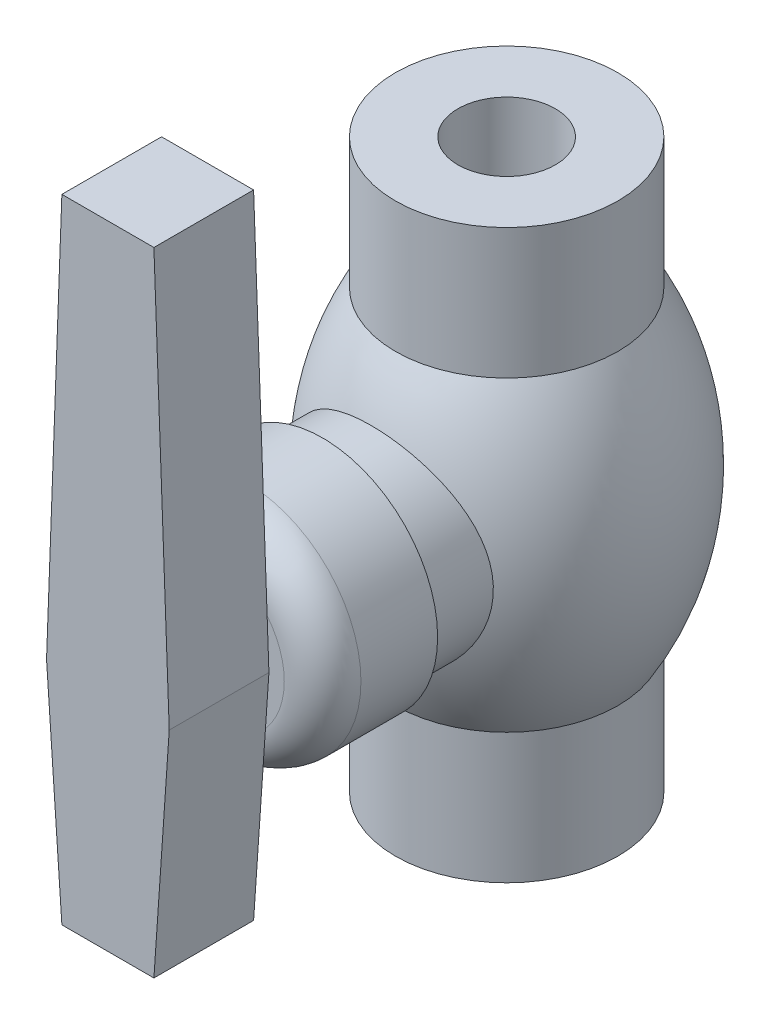
ISO-10303-21;
HEADER;
FILE_DESCRIPTION(('STEP AP214'),'2;1');
FILE_NAME('part.step','',(''),(''),'','','');
FILE_SCHEMA(('AUTOMOTIVE_DESIGN { 1 0 10303 214 1 1 1 1 }'));
ENDSEC;
DATA;
#1=APPLICATION_CONTEXT('core data for automotive mechanical design processes');
#2=APPLICATION_PROTOCOL_DEFINITION('international standard','automotive_design',2000,#1);
#3=PRODUCT_CONTEXT('',#1,'mechanical');
#4=PRODUCT('Part','Part','',(#3));
#5=PRODUCT_RELATED_PRODUCT_CATEGORY('part','',(#4));
#6=PRODUCT_DEFINITION_FORMATION('','',#4);
#7=PRODUCT_DEFINITION_CONTEXT('part definition',#1,'design');
#8=PRODUCT_DEFINITION('design','',#6,#7);
#9=PRODUCT_DEFINITION_SHAPE('','',#8);
#10=(LENGTH_UNIT() NAMED_UNIT(*) SI_UNIT(.MILLI.,.METRE.));
#11=(NAMED_UNIT(*) PLANE_ANGLE_UNIT() SI_UNIT($,.RADIAN.));
#12=(NAMED_UNIT(*) SI_UNIT($,.STERADIAN.) SOLID_ANGLE_UNIT());
#13=UNCERTAINTY_MEASURE_WITH_UNIT(LENGTH_MEASURE(1.E-05),#10,'distance_accuracy_value','');
#14=(GEOMETRIC_REPRESENTATION_CONTEXT(3) GLOBAL_UNCERTAINTY_ASSIGNED_CONTEXT((#13)) GLOBAL_UNIT_ASSIGNED_CONTEXT((#10,
#11,#12)) REPRESENTATION_CONTEXT('',''));
#15=CARTESIAN_POINT('',(0.,0.,0.));
#16=DIRECTION('',(0.,0.,1.));
#17=DIRECTION('',(1.,0.,0.));
#18=AXIS2_PLACEMENT_3D('',#15,#16,#17);
#19=CARTESIAN_POINT('',(0.,37.,39.));
#20=DIRECTION('',(0.,0.,1.));
#21=DIRECTION('',(1.,0.,0.));
#22=AXIS2_PLACEMENT_3D('',#19,#20,#21);
#23=PLANE('',#22);
#24=DIRECTION('',(-0.0373570833848564,0.999301980544909,0.));
#25=VECTOR('',#24,1.);
#26=CARTESIAN_POINT('',(6.,90.5,39.));
#27=LINE('',#26,#25);
#28=CARTESIAN_POINT('',(8.,37.,39.));
#29=VERTEX_POINT('',#28);
#30=CARTESIAN_POINT('',(7.76441521188647,43.301893082037,39.));
#31=VERTEX_POINT('',#30);
#32=EDGE_CURVE('E65',#29,#31,#27,.T.);
#33=ORIENTED_EDGE('',*,*,#32,.F.);
#34=DIRECTION('',(0.068802091615378,0.997630328422983,0.));
#35=VECTOR('',#34,1.);
#36=CARTESIAN_POINT('',(8.,37.,39.));
#37=LINE('',#36,#35);
#38=CARTESIAN_POINT('',(7.5475842516652,30.4399716491455,39.));
#39=VERTEX_POINT('',#38);
#40=EDGE_CURVE('E142',#39,#29,#37,.T.);
#41=ORIENTED_EDGE('',*,*,#40,.F.);
#42=CARTESIAN_POINT('',(0.,37.,39.));
#43=DIRECTION('',(0.,0.,1.));
#44=DIRECTION('',(1.,0.,0.));
#45=AXIS2_PLACEMENT_3D('',#42,#43,#44);
#46=CIRCLE('',#45,10.);
#47=EDGE_CURVE('E168',#39,#31,#46,.T.);
#48=ORIENTED_EDGE('',*,*,#47,.T.);
#49=EDGE_LOOP('',(#33,#41,#48));
#50=FACE_BOUND('',#49,.T.);
#51=ADVANCED_FACE('F49',(#50),#23,.T.);
#52=DIRECTION('',(0.0688020916153783,-0.997630328422983,0.));
#53=VECTOR('',#52,1.);
#54=CARTESIAN_POINT('',(-6.,8.,39.));
#55=LINE('',#54,#53);
#56=CARTESIAN_POINT('',(-8.,37.,39.));
#57=VERTEX_POINT('',#56);
#58=CARTESIAN_POINT('',(-7.5475842516652,30.4399716491455,39.));
#59=VERTEX_POINT('',#58);
#60=EDGE_CURVE('E73',#57,#59,#55,.T.);
#61=ORIENTED_EDGE('',*,*,#60,.F.);
#62=DIRECTION('',(-0.0373570833848564,-0.999301980544909,0.));
#63=VECTOR('',#62,1.);
#64=CARTESIAN_POINT('',(-8.,37.,39.));
#65=LINE('',#64,#63);
#66=CARTESIAN_POINT('',(-7.76441521188647,43.301893082037,39.));
#67=VERTEX_POINT('',#66);
#68=EDGE_CURVE('E284',#67,#57,#65,.T.);
#69=ORIENTED_EDGE('',*,*,#68,.F.);
#70=EDGE_CURVE('E251',#67,#59,#46,.T.);
#71=ORIENTED_EDGE('',*,*,#70,.T.);
#72=EDGE_LOOP('',(#61,#69,#71));
#73=FACE_BOUND('',#72,.T.);
#74=ADVANCED_FACE('F204',(#73),#23,.T.);
#75=CARTESIAN_POINT('',(0.,37.,0.));
#76=DIRECTION('',(0.,1.,0.));
#77=DIRECTION('',(0.,0.,1.));
#78=AXIS2_PLACEMENT_3D('',#75,#76,#77);
#79=DEGENERATE_TOROIDAL_SURFACE('',#78,19.1136363636365,39.1136363636364,.F.);
#80=CARTESIAN_POINT('',(0.,57.,0.));
#81=DIRECTION('',(0.,1.,0.));
#82=DIRECTION('',(0.,0.,1.));
#83=AXIS2_PLACEMENT_3D('',#80,#81,#82);
#84=CIRCLE('',#83,14.5);
#85=CARTESIAN_POINT('',(0.,57.,14.5));
#86=VERTEX_POINT('',#85);
#87=EDGE_CURVE('E235',#86,#86,#84,.T.);
#88=ORIENTED_EDGE('',*,*,#87,.F.);
#89=EDGE_LOOP('',(#88));
#90=FACE_BOUND('',#89,.T.);
#91=CARTESIAN_POINT('',(0.,17.,0.));
#92=DIRECTION('',(0.,1.,0.));
#93=DIRECTION('',(0.,0.,1.));
#94=AXIS2_PLACEMENT_3D('',#91,#92,#93);
#95=CIRCLE('',#94,14.5);
#96=CARTESIAN_POINT('',(0.,17.,14.5));
#97=VERTEX_POINT('',#96);
#98=EDGE_CURVE('E237',#97,#97,#95,.T.);
#99=ORIENTED_EDGE('',*,*,#98,.T.);
#100=EDGE_LOOP('',(#99));
#101=FACE_BOUND('',#100,.T.);
#102=CARTESIAN_POINT('',(-9.58915006029487,27.8561112692057,16.3055060527154));
#103=CARTESIAN_POINT('',(-9.33505112534327,27.5896408380947,16.3806102794738));
#104=CARTESIAN_POINT('',(-9.06975754849437,27.3336799283419,16.4557055802235));
#105=CARTESIAN_POINT('',(-8.51833584255664,26.8443885067637,16.6039013230531));
#106=CARTESIAN_POINT('',(-8.23219583180887,26.6110710803239,16.677000594325));
#107=CARTESIAN_POINT('',(-7.64013806207909,26.1682075063979,16.8194418240796));
#108=CARTESIAN_POINT('',(-7.33417795507547,25.9587150822007,16.8887751137798));
#109=CARTESIAN_POINT('',(-6.70487100922644,25.5656291058284,17.0216945932502));
#110=CARTESIAN_POINT('',(-6.38152476942059,25.3820346621267,17.0852809808279));
#111=CARTESIAN_POINT('',(-5.71889435318338,25.0419211959728,17.2051230635865));
#112=CARTESIAN_POINT('',(-5.37958523525116,24.8854464629602,17.2613667310325));
#113=CARTESIAN_POINT('',(-4.68775146969514,24.6013176904862,17.3648732505529));
#114=CARTESIAN_POINT('',(-4.33522629117992,24.4736648102531,17.412135741388));
#115=CARTESIAN_POINT('',(-3.61981274467797,24.2485316047142,17.4963159965517));
#116=CARTESIAN_POINT('',(-3.2569341570153,24.151023770609,17.5332431894034));
#117=CARTESIAN_POINT('',(-2.52327447848782,23.9870507764702,17.5957479988628));
#118=CARTESIAN_POINT('',(-2.15249384043476,23.9205838426721,17.621326263976));
#119=CARTESIAN_POINT('',(-1.42302230802415,23.8217319866991,17.6594951674999));
#120=CARTESIAN_POINT('',(-1.0645509240864,23.7879313704359,17.6726247651617));
#121=CARTESIAN_POINT('',(-0.345813249266993,23.7496259437655,17.687510667283));
#122=CARTESIAN_POINT('',(0.0144529906591121,23.74512030637,17.6892672927979));
#123=CARTESIAN_POINT('',(0.734017996736808,23.7654517801994,17.6813594949177));
#124=CARTESIAN_POINT('',(1.09331678701187,23.790288152858,17.671695358994));
#125=CARTESIAN_POINT('',(1.80822885838209,23.8690392500391,17.6412096827634));
#126=CARTESIAN_POINT('',(2.16384217924382,23.922953660473,17.6203882629728));
#127=CARTESIAN_POINT('',(2.857076998821,24.0570442103373,17.5690153988788));
#128=CARTESIAN_POINT('',(3.19490439400795,24.1362919134859,17.5388088692271));
#129=CARTESIAN_POINT('',(3.86242044091598,24.3207214527159,17.4692376130267));
#130=CARTESIAN_POINT('',(4.19210932507169,24.4259025471987,17.4298731483627));
#131=CARTESIAN_POINT('',(4.84132462147206,24.6613081440597,17.3429299593681));
#132=CARTESIAN_POINT('',(5.16085017073255,24.7915347665113,17.2953505396865));
#133=CARTESIAN_POINT('',(5.78784831757246,25.0759974480954,17.1930957730212));
#134=CARTESIAN_POINT('',(6.09532047688246,25.2302343792474,17.1384201683265));
#135=CARTESIAN_POINT('',(6.70797981700207,25.5679193023914,17.0210290788604));
#136=CARTESIAN_POINT('',(7.01263340312978,25.7522564846751,16.9580866110857));
#137=CARTESIAN_POINT('',(7.60542563611257,26.1442969531772,16.8274266718723));
#138=CARTESIAN_POINT('',(7.89356395971616,26.3520006965112,16.7597091070289));
#139=CARTESIAN_POINT('',(8.4518400485438,26.789481431537,16.6211051996166));
#140=CARTESIAN_POINT('',(8.7219743294374,27.0192626750095,16.5502182480846));
#141=CARTESIAN_POINT('',(9.24285111149841,27.4995913910674,16.4069592289389));
#142=CARTESIAN_POINT('',(9.49358666057865,27.7501462424341,16.3345866405547));
#143=CARTESIAN_POINT('',(9.98873972211423,28.2862958015403,16.1857729349391));
#144=CARTESIAN_POINT('',(10.2318629590655,28.5730925832896,16.1093498427914));
#145=CARTESIAN_POINT('',(10.6931610821425,29.1667300229726,15.9589750578146));
#146=CARTESIAN_POINT('',(10.9113344835078,29.4735718720795,15.8850235122519));
#147=CARTESIAN_POINT('',(11.3212763100759,30.1055745711243,15.7417460314561));
#148=CARTESIAN_POINT('',(11.5130376259675,30.430740320226,15.6724213442071));
#149=CARTESIAN_POINT('',(11.8685342600745,31.0972070752125,15.5406021070034));
#150=CARTESIAN_POINT('',(12.0322813667771,31.4385012166647,15.4781046881296));
#151=CARTESIAN_POINT('',(12.3299570670431,32.1340666950035,15.3621582110482));
#152=CARTESIAN_POINT('',(12.4639770481632,32.4882942481425,15.3086815460326));
#153=CARTESIAN_POINT('',(12.7015323354265,33.2082644493345,15.2124225347895));
#154=CARTESIAN_POINT('',(12.8050675530238,33.5740071308308,15.1696402196247));
#155=CARTESIAN_POINT('',(12.9804601128749,34.3139913102315,15.0963960786841));
#156=CARTESIAN_POINT('',(13.0523373033381,34.6882273279603,15.065926534327));
#157=CARTESIAN_POINT('',(13.163639385975,35.4423326311168,15.0184733357989));
#158=CARTESIAN_POINT('',(13.203066831351,35.8222014709496,15.0014886206218));
#159=CARTESIAN_POINT('',(13.2472727413251,36.5559675165181,14.9824256695477));
#160=CARTESIAN_POINT('',(13.2544067759173,36.9096986120238,14.9793341582049));
#161=CARTESIAN_POINT('',(13.2403688330847,37.6164814239297,14.9854000672207));
#162=CARTESIAN_POINT('',(13.2191983391036,37.9695331749634,14.9945568456449));
#163=CARTESIAN_POINT('',(13.1487887672327,38.6722949723202,15.0247956066135));
#164=CARTESIAN_POINT('',(13.0995501300568,39.022005071025,15.0458774019164));
#165=CARTESIAN_POINT('',(12.9735308668001,39.715552034853,15.0992381120389));
#166=CARTESIAN_POINT('',(12.8967500010252,40.059388848835,15.1315171243054));
#167=CARTESIAN_POINT('',(12.7186960563347,40.730235688714,15.2052546448294));
#168=CARTESIAN_POINT('',(12.6180907865277,41.0574513653701,15.2464606277972));
#169=CARTESIAN_POINT('',(12.3922770721051,41.7022004310446,15.3372706203739));
#170=CARTESIAN_POINT('',(12.2670598638383,42.019730324556,15.3868776204863));
#171=CARTESIAN_POINT('',(11.9930483709293,42.6431561720666,15.4930642635599));
#172=CARTESIAN_POINT('',(11.8442583193334,42.9490542026284,15.5496426542429));
#173=CARTESIAN_POINT('',(11.5240541157835,43.5478243663737,15.6682957966374));
#174=CARTESIAN_POINT('',(11.3526296579565,43.8406904841765,15.7303730478209));
#175=CARTESIAN_POINT('',(10.9762368494292,44.4306871639996,15.862670866022));
#176=CARTESIAN_POINT('',(10.7698010024069,44.7268224318868,15.9331584818111));
#177=CARTESIAN_POINT('',(10.3338936846017,45.3007809624957,16.0766394439987));
#178=CARTESIAN_POINT('',(10.1044307413328,45.5786109414481,16.1496318562666));
#179=CARTESIAN_POINT('',(9.62357195559642,46.114775101091,16.2963086193617));
#180=CARTESIAN_POINT('',(9.37216046779152,46.3730951260109,16.3699934298012));
#181=CARTESIAN_POINT('',(8.849038556468,46.8684720173052,16.5161208174702));
#182=CARTESIAN_POINT('',(8.5773352401817,47.1055362651104,16.5885638188154));
#183=CARTESIAN_POINT('',(8.00004813623194,47.5691034398786,16.7342185235381));
#184=CARTESIAN_POINT('',(7.69343085615931,47.7943732899285,16.8072660392149));
#185=CARTESIAN_POINT('',(7.06108512249273,48.2182198838846,16.9480215068766));
#186=CARTESIAN_POINT('',(6.73535587218774,48.4167955138652,17.0157292359885));
#187=CARTESIAN_POINT('',(6.06693127316582,48.7856061693223,17.1439132888519));
#188=CARTESIAN_POINT('',(5.72423890389529,48.9558461489915,17.2043908761962));
#189=CARTESIAN_POINT('',(5.02418024797877,49.2664882913062,17.3164108588058));
#190=CARTESIAN_POINT('',(4.66681468742794,49.4068919282693,17.3679536955449));
#191=CARTESIAN_POINT('',(3.95156466146204,49.6525112198712,17.4591339039992));
#192=CARTESIAN_POINT('',(3.59405693853563,49.758702580441,17.4990973234291));
#193=CARTESIAN_POINT('',(2.87035602035131,49.9407403142506,17.5681207888772));
#194=CARTESIAN_POINT('',(2.50416296375634,50.0165871716009,17.5971810088426));
#195=CARTESIAN_POINT('',(1.76608126881376,50.1370935294715,17.6435524744008));
#196=CARTESIAN_POINT('',(1.39419480949011,50.1817646712234,17.6608681054378));
#197=CARTESIAN_POINT('',(0.647614234295598,50.2394581587371,17.6832591210736));
#198=CARTESIAN_POINT('',(0.272920252786654,50.2524820094875,17.6883350877302));
#199=CARTESIAN_POINT('',(-0.453484401131742,50.2469124729249,17.6861687643577));
#200=CARTESIAN_POINT('',(-0.805213171576679,50.2301854914479,17.679653630114));
#201=CARTESIAN_POINT('',(-1.50584988879863,50.1688483456435,17.6558649108212));
#202=CARTESIAN_POINT('',(-1.85475796428487,50.1242394609338,17.6385918195));
#203=CARTESIAN_POINT('',(-2.54726754026415,50.0075835037399,17.5937336299367));
#204=CARTESIAN_POINT('',(-2.8908691350939,49.9355369196188,17.5661487152346));
#205=CARTESIAN_POINT('',(-3.57042548215312,49.7646901585485,17.5013667420804));
#206=CARTESIAN_POINT('',(-3.90638010007096,49.6658895120831,17.4641695149391));
#207=CARTESIAN_POINT('',(-4.56770516019958,49.4426723661332,17.3811798918594));
#208=CARTESIAN_POINT('',(-4.89309780648686,49.3183142624243,17.3354071107604));
#209=CARTESIAN_POINT('',(-5.53211529461657,49.0448737842273,17.2363135913232));
#210=CARTESIAN_POINT('',(-5.84574023803469,48.895791623211,17.1829929181555));
#211=CARTESIAN_POINT('',(-6.45945227162131,48.5740238278229,17.0700523914511));
#212=CARTESIAN_POINT('',(-6.7595390485443,48.4013376476743,17.0104323922674));
#213=CARTESIAN_POINT('',(-7.34467340364415,48.0334833039053,16.8862401016322));
#214=CARTESIAN_POINT('',(-7.62971510587494,47.8383064497682,16.8216658990927));
#215=CARTESIAN_POINT('',(-8.1990537330334,47.4149395829439,16.6852439419239));
#216=CARTESIAN_POINT('',(-8.48237215881286,47.1854987547879,16.6131914283995));
#217=CARTESIAN_POINT('',(-9.02898246544315,46.7042588923338,16.466989931362));
#218=CARTESIAN_POINT('',(-9.29226502210368,46.4524495650147,16.392839993513));
#219=CARTESIAN_POINT('',(-9.79729456418827,45.9279398439489,16.2443341030221));
#220=CARTESIAN_POINT('',(-10.0390328913949,45.655231132292,16.1699780798258));
#221=CARTESIAN_POINT('',(-10.4993418987919,45.0906686942122,16.0230666090941));
#222=CARTESIAN_POINT('',(-10.7179226240751,44.7988233583731,15.9505103914024));
#223=CARTESIAN_POINT('',(-11.1395634378133,44.1845190130475,15.8060878671105));
#224=CARTESIAN_POINT('',(-11.3415496291194,43.86128286087,15.7343858585973));
#225=CARTESIAN_POINT('',(-11.7173442870418,43.1977144739804,15.5973112861976));
#226=CARTESIAN_POINT('',(-11.8911642531485,42.8573892909607,15.5319361436398));
#227=CARTESIAN_POINT('',(-12.2092220195862,42.1617477673212,15.4096571251322));
#228=CARTESIAN_POINT('',(-12.3534631034195,41.8064330959451,15.3527523090983));
#229=CARTESIAN_POINT('',(-12.6109744597759,41.0832720260969,15.2494288922865));
#230=CARTESIAN_POINT('',(-12.7242467301667,40.7154264377449,15.2030096150967));
#231=CARTESIAN_POINT('',(-12.9144648624802,39.9858222866666,15.124120687915));
#232=CARTESIAN_POINT('',(-12.9927477551005,39.6244673337731,15.0911428643132));
#233=CARTESIAN_POINT('',(-13.1189208400181,38.8955728408059,15.0376180697197));
#234=CARTESIAN_POINT('',(-13.1668118537318,38.5280334681571,15.017070762763));
#235=CARTESIAN_POINT('',(-13.2316166634038,37.7899337154789,14.9891983051486));
#236=CARTESIAN_POINT('',(-13.2485473443246,37.419375092904,14.9818659474318));
#237=CARTESIAN_POINT('',(-13.2512732678008,36.6781314545269,14.9806881172934));
#238=CARTESIAN_POINT('',(-13.237070039446,36.3074464458259,14.9868419825187));
#239=CARTESIAN_POINT('',(-13.1797718569936,35.5946689049906,15.011504044147));
#240=CARTESIAN_POINT('',(-13.138749237003,35.2523765491473,15.0291257069756));
#241=CARTESIAN_POINT('',(-13.0303259299808,34.5727575960723,15.0752483718436));
#242=CARTESIAN_POINT('',(-12.9629263983309,34.2354307820077,15.1037488973575));
#243=CARTESIAN_POINT('',(-12.8023464244133,33.5677380562677,15.1707417759635));
#244=CARTESIAN_POINT('',(-12.7091473780067,33.2373773535892,15.2092413381606));
#245=CARTESIAN_POINT('',(-12.4978254697704,32.5859167172774,15.2950442734977));
#246=CARTESIAN_POINT('',(-12.3797025447054,32.2648168071423,15.3423476689741));
#247=CARTESIAN_POINT('',(-12.1167415090651,31.6270537486889,15.4454679518264));
#248=CARTESIAN_POINT('',(-11.9713922271761,31.3106272312191,15.5014434350527));
#249=CARTESIAN_POINT('',(-11.6567909117473,30.6910828258733,15.6195624067384));
#250=CARTESIAN_POINT('',(-11.4875377393908,30.3879655729727,15.6817061890228));
#251=CARTESIAN_POINT('',(-11.1266181896586,29.7971890802496,15.8103759928439));
#252=CARTESIAN_POINT('',(-10.934994159727,29.5095020915843,15.8768936337403));
#253=CARTESIAN_POINT('',(-10.5302938307927,28.9505039719662,16.0127167675561));
#254=CARTESIAN_POINT('',(-10.3172282147117,28.6791847927436,16.082020861936));
#255=CARTESIAN_POINT('',(-10.0125708313372,28.320901121719,16.1773856788036));
#256=CARTESIAN_POINT('',(-9.92973828202433,28.2262544488108,16.2029662847629));
#257=CARTESIAN_POINT('',(-9.76142252483426,28.0393669018409,16.2542002911872));
#258=CARTESIAN_POINT('',(-9.67593928192838,27.9471260596017,16.2798536926101));
#259=CARTESIAN_POINT('',(-9.58915006029487,27.8561112692057,16.3055060527154));
#260=B_SPLINE_CURVE_WITH_KNOTS('',3,(#102,#103,#104,#105,#106,#107,#108,#109,#110,#111,#112,
#113,#114,#115,#116,#117,#118,#119,#120,#121,#122,#123,#124,#125,#126,#127,#128,#129,#130,#131,
#132,#133,#134,#135,#136,#137,#138,#139,#140,#141,#142,#143,#144,#145,#146,#147,#148,#149,#150,
#151,#152,#153,#154,#155,#156,#157,#158,#159,#160,#161,#162,#163,#164,#165,#166,#167,#168,#169,
#170,#171,#172,#173,#174,#175,#176,#177,#178,#179,#180,#181,#182,#183,#184,#185,#186,#187,#188,
#189,#190,#191,#192,#193,#194,#195,#196,#197,#198,#199,#200,#201,#202,#203,#204,#205,#206,#207,
#208,#209,#210,#211,#212,#213,#214,#215,#216,#217,#218,#219,#220,#221,#222,#223,#224,#225,#226,
#227,#228,#229,#230,#231,#232,#233,#234,#235,#236,#237,#238,#239,#240,#241,#242,#243,#244,#245,
#246,#247,#248,#249,#250,#251,#252,#253,#254,#255,#256,#257,#258,#259),.UNSPECIFIED.,.T.,.F.,(4,
2,2,2,2,2,2,2,2,2,2,2,2,2,2,2,2,2,2,2,2,2,2,2,2,2,2,2,2,2,2,2,2,2,2,2,2,2,2,2,2,2,2,2,2,2,2,2,2,
2,2,2,2,2,2,2,2,2,2,2,2,2,2,2,2,2,2,2,2,2,2,2,2,2,2,2,2,2,4),(0.,1.12723674183502,
2.25512106848825,3.38550025757557,4.51584052435081,5.64800971319917,6.78022443030994,
7.91140287651327,9.04251667608202,10.1220612516783,11.2015753519338,12.2810622803743,
13.3605375488933,14.4042784268204,15.4479894610997,16.4917888831574,17.535626223333,
18.6192421820208,19.7028793429705,20.7867256153675,21.8709585327449,23.0206181609242,
24.1703461695965,25.3203830469854,26.4699347876985,27.6159020117369,28.7618725643109,
29.9071236167874,31.0522845503107,32.1124073758268,33.1724746423554,34.2325252646213,
35.2925851125034,36.3258624525284,37.3595083836122,38.3929689097372,39.4269016231759,
40.529104630114,41.6309009593041,42.7334891845676,43.8356930221954,44.9965422943584,
46.157439992686,47.3181345064753,48.4787716529654,49.6025575480774,50.7263255138032,
51.8496736318172,52.972968327907,54.028257572149,55.0834983882895,56.1387204230968,
57.1939609775632,58.2468167161715,59.2996633647172,60.3525343615025,61.4058135661819,
62.519444056376,63.6335896725601,64.748181042477,65.8622869383878,67.0243757740013,
68.1859889589478,69.3474731252673,70.5088823439444,71.6210292366079,72.7331460694479,
73.844656201522,74.9561117448606,75.9904740313258,77.024791014938,78.0598558005614,
79.0949232123155,80.1518339001574,81.2087949577869,82.2637867041145,83.3182553961493,
83.7032656916933,84.0882810772917),.UNSPECIFIED.);
#261=CARTESIAN_POINT('',(-9.58915006029487,27.8561112692057,16.3055060527154));
#262=VERTEX_POINT('',#261);
#263=EDGE_CURVE('E159',#262,#262,#260,.T.);
#264=ORIENTED_EDGE('',*,*,#263,.F.);
#265=EDGE_LOOP('',(#264));
#266=FACE_BOUND('',#265,.T.);
#267=ADVANCED_FACE('F172',(#90,#101,#266),#79,.F.);
#268=CARTESIAN_POINT('',(0.,0.,0.));
#269=DIRECTION('',(0.,1.,0.));
#270=DIRECTION('',(0.,0.,1.));
#271=AXIS2_PLACEMENT_3D('',#268,#269,#270);
#272=CYLINDRICAL_SURFACE('',#271,6.35);
#273=CARTESIAN_POINT('',(0.,74.,0.));
#274=DIRECTION('',(0.,1.,0.));
#275=DIRECTION('',(0.,0.,1.));
#276=AXIS2_PLACEMENT_3D('',#273,#274,#275);
#277=CIRCLE('',#276,6.35);
#278=CARTESIAN_POINT('',(0.,74.,6.35));
#279=VERTEX_POINT('',#278);
#280=EDGE_CURVE('E158',#279,#279,#277,.T.);
#281=ORIENTED_EDGE('',*,*,#280,.T.);
#282=EDGE_LOOP('',(#281));
#283=FACE_BOUND('',#282,.T.);
#284=CARTESIAN_POINT('',(0.,0.,0.));
#285=DIRECTION('',(0.,1.,0.));
#286=DIRECTION('',(0.,0.,1.));
#287=AXIS2_PLACEMENT_3D('',#284,#285,#286);
#288=CIRCLE('',#287,6.35);
#289=CARTESIAN_POINT('',(0.,0.,6.35));
#290=VERTEX_POINT('',#289);
#291=EDGE_CURVE('E170',#290,#290,#288,.T.);
#292=ORIENTED_EDGE('',*,*,#291,.F.);
#293=EDGE_LOOP('',(#292));
#294=FACE_BOUND('',#293,.T.);
#295=ADVANCED_FACE('F185',(#283,#294),#272,.F.);
#296=CARTESIAN_POINT('',(14.5,74.,0.));
#297=DIRECTION('',(0.,-1.,0.));
#298=DIRECTION('',(0.,0.,-1.));
#299=AXIS2_PLACEMENT_3D('',#296,#297,#298);
#300=PLANE('',#299);
#301=ORIENTED_EDGE('',*,*,#280,.F.);
#302=EDGE_LOOP('',(#301));
#303=FACE_BOUND('',#302,.T.);
#304=CARTESIAN_POINT('',(0.,74.,0.));
#305=DIRECTION('',(0.,1.,0.));
#306=DIRECTION('',(0.,0.,1.));
#307=AXIS2_PLACEMENT_3D('',#304,#305,#306);
#308=CIRCLE('',#307,14.5);
#309=CARTESIAN_POINT('',(0.,74.,14.5));
#310=VERTEX_POINT('',#309);
#311=EDGE_CURVE('E169',#310,#310,#308,.T.);
#312=ORIENTED_EDGE('',*,*,#311,.T.);
#313=EDGE_LOOP('',(#312));
#314=FACE_BOUND('',#313,.T.);
#315=ADVANCED_FACE('F188',(#303,#314),#300,.F.);
#316=CARTESIAN_POINT('',(0.,74.,0.));
#317=DIRECTION('',(0.,1.,0.));
#318=DIRECTION('',(0.,0.,1.));
#319=AXIS2_PLACEMENT_3D('',#316,#317,#318);
#320=CYLINDRICAL_SURFACE('',#319,14.5);
#321=ORIENTED_EDGE('',*,*,#311,.F.);
#322=EDGE_LOOP('',(#321));
#323=FACE_BOUND('',#322,.T.);
#324=ORIENTED_EDGE('',*,*,#87,.T.);
#325=EDGE_LOOP('',(#324));
#326=FACE_BOUND('',#325,.T.);
#327=ADVANCED_FACE('F194',(#323,#326),#320,.T.);
#328=CARTESIAN_POINT('',(0.,74.,0.));
#329=DIRECTION('',(0.,1.,0.));
#330=DIRECTION('',(0.,0.,1.));
#331=AXIS2_PLACEMENT_3D('',#328,#329,#330);
#332=CYLINDRICAL_SURFACE('',#331,14.5);
#333=ORIENTED_EDGE('',*,*,#98,.F.);
#334=EDGE_LOOP('',(#333));
#335=FACE_BOUND('',#334,.T.);
#336=CARTESIAN_POINT('',(0.,0.,0.));
#337=DIRECTION('',(0.,1.,0.));
#338=DIRECTION('',(0.,0.,1.));
#339=AXIS2_PLACEMENT_3D('',#336,#337,#338);
#340=CIRCLE('',#339,14.5);
#341=CARTESIAN_POINT('',(0.,0.,14.5));
#342=VERTEX_POINT('',#341);
#343=EDGE_CURVE('E239',#342,#342,#340,.T.);
#344=ORIENTED_EDGE('',*,*,#343,.T.);
#345=EDGE_LOOP('',(#344));
#346=FACE_BOUND('',#345,.T.);
#347=ADVANCED_FACE('F191',(#335,#346),#332,.T.);
#348=CARTESIAN_POINT('',(0.,0.,0.));
#349=DIRECTION('',(0.,1.,0.));
#350=DIRECTION('',(0.,0.,1.));
#351=AXIS2_PLACEMENT_3D('',#348,#349,#350);
#352=PLANE('',#351);
#353=ORIENTED_EDGE('',*,*,#291,.T.);
#354=EDGE_LOOP('',(#353));
#355=FACE_BOUND('',#354,.T.);
#356=ORIENTED_EDGE('',*,*,#343,.F.);
#357=EDGE_LOOP('',(#356));
#358=FACE_BOUND('',#357,.T.);
#359=ADVANCED_FACE('F182',(#355,#358),#352,.F.);
#360=CARTESIAN_POINT('',(0.,37.,24.));
#361=DIRECTION('',(0.,0.,-1.));
#362=DIRECTION('',(-1.,0.,0.));
#363=AXIS2_PLACEMENT_3D('',#360,#361,#362);
#364=CYLINDRICAL_SURFACE('',#363,13.25);
#365=CARTESIAN_POINT('',(0.,37.,24.));
#366=DIRECTION('',(0.,0.,1.));
#367=DIRECTION('',(1.,0.,0.));
#368=AXIS2_PLACEMENT_3D('',#365,#366,#367);
#369=CIRCLE('',#368,13.25);
#370=CARTESIAN_POINT('',(13.25,37.,24.));
#371=VERTEX_POINT('',#370);
#372=EDGE_CURVE('E149',#371,#371,#369,.T.);
#373=ORIENTED_EDGE('',*,*,#372,.F.);
#374=EDGE_LOOP('',(#373));
#375=FACE_BOUND('',#374,.T.);
#376=ORIENTED_EDGE('',*,*,#263,.T.);
#377=EDGE_LOOP('',(#376));
#378=FACE_BOUND('',#377,.T.);
#379=ADVANCED_FACE('F176',(#375,#378),#364,.T.);
#380=CARTESIAN_POINT('',(0.,37.,39.));
#381=DIRECTION('',(0.,0.,-1.));
#382=DIRECTION('',(-1.,0.,0.));
#383=AXIS2_PLACEMENT_3D('',#380,#381,#382);
#384=CYLINDRICAL_SURFACE('',#383,15.);
#385=CARTESIAN_POINT('',(0.,37.,34.));
#386=DIRECTION('',(0.,0.,1.));
#387=DIRECTION('',(1.,0.,0.));
#388=AXIS2_PLACEMENT_3D('',#385,#386,#387);
#389=CIRCLE('',#388,15.);
#390=CARTESIAN_POINT('',(15.,37.,34.));
#391=VERTEX_POINT('',#390);
#392=EDGE_CURVE('E11',#391,#391,#389,.F.);
#393=ORIENTED_EDGE('',*,*,#392,.T.);
#394=EDGE_LOOP('',(#393));
#395=FACE_BOUND('',#394,.T.);
#396=CARTESIAN_POINT('',(0.,37.,24.));
#397=DIRECTION('',(0.,0.,1.));
#398=DIRECTION('',(1.,0.,0.));
#399=AXIS2_PLACEMENT_3D('',#396,#397,#398);
#400=CIRCLE('',#399,15.);
#401=CARTESIAN_POINT('',(15.,37.,24.));
#402=VERTEX_POINT('',#401);
#403=EDGE_CURVE('E144',#402,#402,#400,.T.);
#404=ORIENTED_EDGE('',*,*,#403,.T.);
#405=EDGE_LOOP('',(#404));
#406=FACE_BOUND('',#405,.T.);
#407=ADVANCED_FACE('F181',(#395,#406),#384,.T.);
#408=CARTESIAN_POINT('',(0.,37.,24.));
#409=DIRECTION('',(0.,0.,1.));
#410=DIRECTION('',(1.,0.,0.));
#411=AXIS2_PLACEMENT_3D('',#408,#409,#410);
#412=PLANE('',#411);
#413=ORIENTED_EDGE('',*,*,#372,.T.);
#414=EDGE_LOOP('',(#413));
#415=FACE_BOUND('',#414,.T.);
#416=ORIENTED_EDGE('',*,*,#403,.F.);
#417=EDGE_LOOP('',(#416));
#418=FACE_BOUND('',#417,.T.);
#419=ADVANCED_FACE('F211',(#415,#418),#412,.F.);
#420=CARTESIAN_POINT('',(0.,37.,34.));
#421=DIRECTION('',(0.,0.,1.));
#422=DIRECTION('',(1.,0.,0.));
#423=AXIS2_PLACEMENT_3D('',#420,#421,#422);
#424=TOROIDAL_SURFACE('',#423,10.,5.);
#425=ORIENTED_EDGE('',*,*,#392,.F.);
#426=EDGE_LOOP('',(#425));
#427=FACE_BOUND('',#426,.T.);
#428=EDGE_CURVE('E58',#31,#67,#46,.T.);
#429=ORIENTED_EDGE('',*,*,#428,.F.);
#430=ORIENTED_EDGE('',*,*,#47,.F.);
#431=EDGE_CURVE('E258',#59,#39,#46,.T.);
#432=ORIENTED_EDGE('',*,*,#431,.F.);
#433=ORIENTED_EDGE('',*,*,#70,.F.);
#434=EDGE_LOOP('',(#429,#430,#432,#433));
#435=FACE_BOUND('',#434,.T.);
#436=ADVANCED_FACE('F51',(#427,#435),#424,.T.);
#437=CARTESIAN_POINT('',(0.,0.,39.));
#438=DIRECTION('',(0.,0.,1.));
#439=DIRECTION('',(1.,0.,0.));
#440=AXIS2_PLACEMENT_3D('',#437,#438,#439);
#441=PLANE('',#440);
#442=ORIENTED_EDGE('',*,*,#431,.T.);
#443=CARTESIAN_POINT('',(6.,8.00000000000001,39.));
#444=VERTEX_POINT('',#443);
#445=EDGE_CURVE('E267',#444,#39,#37,.T.);
#446=ORIENTED_EDGE('',*,*,#445,.F.);
#447=DIRECTION('',(1.,0.,0.));
#448=VECTOR('',#447,1.);
#449=CARTESIAN_POINT('',(-6.,8.,39.));
#450=LINE('',#449,#448);
#451=CARTESIAN_POINT('',(-6.,8.,39.));
#452=VERTEX_POINT('',#451);
#453=EDGE_CURVE('E138',#452,#444,#450,.T.);
#454=ORIENTED_EDGE('',*,*,#453,.F.);
#455=EDGE_CURVE('E268',#59,#452,#55,.T.);
#456=ORIENTED_EDGE('',*,*,#455,.F.);
#457=EDGE_LOOP('',(#442,#446,#454,#456));
#458=FACE_BOUND('',#457,.T.);
#459=ADVANCED_FACE('F218',(#458),#441,.F.);
#460=CARTESIAN_POINT('',(8.,37.,52.));
#461=DIRECTION('',(-0.997630328422983,0.068802091615378,0.));
#462=DIRECTION('',(-0.068802091615378,-0.997630328422983,0.));
#463=AXIS2_PLACEMENT_3D('',#460,#461,#462);
#464=PLANE('',#463);
#465=ORIENTED_EDGE('',*,*,#445,.T.);
#466=ORIENTED_EDGE('',*,*,#40,.T.);
#467=DIRECTION('',(0.,0.,-1.));
#468=VECTOR('',#467,1.);
#469=CARTESIAN_POINT('',(8.,37.,52.));
#470=LINE('',#469,#468);
#471=CARTESIAN_POINT('',(8.,37.,52.));
#472=VERTEX_POINT('',#471);
#473=EDGE_CURVE('E121',#472,#29,#470,.T.);
#474=ORIENTED_EDGE('',*,*,#473,.F.);
#475=DIRECTION('',(0.068802091615378,0.997630328422983,0.));
#476=VECTOR('',#475,1.);
#477=CARTESIAN_POINT('',(8.,37.,52.));
#478=LINE('',#477,#476);
#479=CARTESIAN_POINT('',(6.,8.00000000000001,52.));
#480=VERTEX_POINT('',#479);
#481=EDGE_CURVE('E128',#480,#472,#478,.T.);
#482=ORIENTED_EDGE('',*,*,#481,.F.);
#483=DIRECTION('',(0.,0.,-1.));
#484=VECTOR('',#483,1.);
#485=CARTESIAN_POINT('',(6.,8.00000000000001,52.));
#486=LINE('',#485,#484);
#487=EDGE_CURVE('E270',#480,#444,#486,.T.);
#488=ORIENTED_EDGE('',*,*,#487,.T.);
#489=EDGE_LOOP('',(#465,#466,#474,#482,#488));
#490=FACE_BOUND('',#489,.T.);
#491=ADVANCED_FACE('F141',(#490),#464,.F.);
#492=CARTESIAN_POINT('',(6.,90.5,52.));
#493=DIRECTION('',(-0.999301980544909,-0.0373570833848564,0.));
#494=DIRECTION('',(0.0373570833848564,-0.999301980544909,0.));
#495=AXIS2_PLACEMENT_3D('',#492,#493,#494);
#496=PLANE('',#495);
#497=ORIENTED_EDGE('',*,*,#32,.T.);
#498=CARTESIAN_POINT('',(6.,90.5,39.));
#499=VERTEX_POINT('',#498);
#500=EDGE_CURVE('E272',#31,#499,#27,.T.);
#501=ORIENTED_EDGE('',*,*,#500,.T.);
#502=DIRECTION('',(0.,0.,-1.));
#503=VECTOR('',#502,1.);
#504=CARTESIAN_POINT('',(6.,90.5,52.));
#505=LINE('',#504,#503);
#506=CARTESIAN_POINT('',(6.,90.5,52.));
#507=VERTEX_POINT('',#506);
#508=EDGE_CURVE('E123',#507,#499,#505,.T.);
#509=ORIENTED_EDGE('',*,*,#508,.F.);
#510=DIRECTION('',(-0.0373570833848564,0.999301980544909,0.));
#511=VECTOR('',#510,1.);
#512=CARTESIAN_POINT('',(6.,90.5,52.));
#513=LINE('',#512,#511);
#514=EDGE_CURVE('E117',#472,#507,#513,.T.);
#515=ORIENTED_EDGE('',*,*,#514,.F.);
#516=ORIENTED_EDGE('',*,*,#473,.T.);
#517=EDGE_LOOP('',(#497,#501,#509,#515,#516));
#518=FACE_BOUND('',#517,.T.);
#519=ADVANCED_FACE('F119',(#518),#496,.F.);
#520=CARTESIAN_POINT('',(-6.,90.5,52.));
#521=DIRECTION('',(0.,-1.,0.));
#522=DIRECTION('',(0.,0.,-1.));
#523=AXIS2_PLACEMENT_3D('',#520,#521,#522);
#524=PLANE('',#523);
#525=DIRECTION('',(-1.,0.,0.));
#526=VECTOR('',#525,1.);
#527=CARTESIAN_POINT('',(-6.,90.5,39.));
#528=LINE('',#527,#526);
#529=CARTESIAN_POINT('',(-6.,90.5,39.));
#530=VERTEX_POINT('',#529);
#531=EDGE_CURVE('E281',#499,#530,#528,.T.);
#532=ORIENTED_EDGE('',*,*,#531,.T.);
#533=DIRECTION('',(0.,0.,-1.));
#534=VECTOR('',#533,1.);
#535=CARTESIAN_POINT('',(-6.,90.5,52.));
#536=LINE('',#535,#534);
#537=CARTESIAN_POINT('',(-6.,90.5,52.));
#538=VERTEX_POINT('',#537);
#539=EDGE_CURVE('E151',#538,#530,#536,.T.);
#540=ORIENTED_EDGE('',*,*,#539,.F.);
#541=DIRECTION('',(-1.,0.,0.));
#542=VECTOR('',#541,1.);
#543=CARTESIAN_POINT('',(-6.,90.5,52.));
#544=LINE('',#543,#542);
#545=EDGE_CURVE('E127',#507,#538,#544,.T.);
#546=ORIENTED_EDGE('',*,*,#545,.F.);
#547=ORIENTED_EDGE('',*,*,#508,.T.);
#548=EDGE_LOOP('',(#532,#540,#546,#547));
#549=FACE_BOUND('',#548,.T.);
#550=ADVANCED_FACE('F312',(#549),#524,.F.);
#551=CARTESIAN_POINT('',(-8.,37.,52.));
#552=DIRECTION('',(0.999301980544909,-0.0373570833848564,0.));
#553=DIRECTION('',(0.0373570833848564,0.999301980544909,0.));
#554=AXIS2_PLACEMENT_3D('',#551,#552,#553);
#555=PLANE('',#554);
#556=EDGE_CURVE('E285',#530,#67,#65,.T.);
#557=ORIENTED_EDGE('',*,*,#556,.T.);
#558=ORIENTED_EDGE('',*,*,#68,.T.);
#559=DIRECTION('',(0.,0.,-1.));
#560=VECTOR('',#559,1.);
#561=CARTESIAN_POINT('',(-8.,37.,52.));
#562=LINE('',#561,#560);
#563=CARTESIAN_POINT('',(-8.,37.,52.));
#564=VERTEX_POINT('',#563);
#565=EDGE_CURVE('E298',#564,#57,#562,.T.);
#566=ORIENTED_EDGE('',*,*,#565,.F.);
#567=DIRECTION('',(-0.0373570833848564,-0.999301980544909,0.));
#568=VECTOR('',#567,1.);
#569=CARTESIAN_POINT('',(-8.,37.,52.));
#570=LINE('',#569,#568);
#571=EDGE_CURVE('E308',#538,#564,#570,.T.);
#572=ORIENTED_EDGE('',*,*,#571,.F.);
#573=ORIENTED_EDGE('',*,*,#539,.T.);
#574=EDGE_LOOP('',(#557,#558,#566,#572,#573));
#575=FACE_BOUND('',#574,.T.);
#576=ADVANCED_FACE('F306',(#575),#555,.F.);
#577=CARTESIAN_POINT('',(-6.,8.,52.));
#578=DIRECTION('',(0.997630328422983,0.0688020916153783,0.));
#579=DIRECTION('',(-0.0688020916153783,0.997630328422983,0.));
#580=AXIS2_PLACEMENT_3D('',#577,#578,#579);
#581=PLANE('',#580);
#582=ORIENTED_EDGE('',*,*,#60,.T.);
#583=ORIENTED_EDGE('',*,*,#455,.T.);
#584=DIRECTION('',(0.,0.,-1.));
#585=VECTOR('',#584,1.);
#586=CARTESIAN_POINT('',(-6.,8.,52.));
#587=LINE('',#586,#585);
#588=CARTESIAN_POINT('',(-6.,8.,52.));
#589=VERTEX_POINT('',#588);
#590=EDGE_CURVE('E294',#589,#452,#587,.T.);
#591=ORIENTED_EDGE('',*,*,#590,.F.);
#592=DIRECTION('',(0.0688020916153783,-0.997630328422983,0.));
#593=VECTOR('',#592,1.);
#594=CARTESIAN_POINT('',(-6.,8.,52.));
#595=LINE('',#594,#593);
#596=EDGE_CURVE('E316',#564,#589,#595,.T.);
#597=ORIENTED_EDGE('',*,*,#596,.F.);
#598=ORIENTED_EDGE('',*,*,#565,.T.);
#599=EDGE_LOOP('',(#582,#583,#591,#597,#598));
#600=FACE_BOUND('',#599,.T.);
#601=ADVANCED_FACE('F323',(#600),#581,.F.);
#602=CARTESIAN_POINT('',(-6.,8.,52.));
#603=DIRECTION('',(0.,1.,0.));
#604=DIRECTION('',(-1.,0.,0.));
#605=AXIS2_PLACEMENT_3D('',#602,#603,#604);
#606=PLANE('',#605);
#607=ORIENTED_EDGE('',*,*,#453,.T.);
#608=ORIENTED_EDGE('',*,*,#487,.F.);
#609=DIRECTION('',(1.,0.,0.));
#610=VECTOR('',#609,1.);
#611=CARTESIAN_POINT('',(-6.,8.,52.));
#612=LINE('',#611,#610);
#613=EDGE_CURVE('E133',#589,#480,#612,.T.);
#614=ORIENTED_EDGE('',*,*,#613,.F.);
#615=ORIENTED_EDGE('',*,*,#590,.T.);
#616=EDGE_LOOP('',(#607,#608,#614,#615));
#617=FACE_BOUND('',#616,.T.);
#618=ADVANCED_FACE('F325',(#617),#606,.F.);
#619=CARTESIAN_POINT('',(0.,0.,52.));
#620=DIRECTION('',(0.,0.,1.));
#621=DIRECTION('',(1.,0.,0.));
#622=AXIS2_PLACEMENT_3D('',#619,#620,#621);
#623=PLANE('',#622);
#624=ORIENTED_EDGE('',*,*,#481,.T.);
#625=ORIENTED_EDGE('',*,*,#514,.T.);
#626=ORIENTED_EDGE('',*,*,#545,.T.);
#627=ORIENTED_EDGE('',*,*,#571,.T.);
#628=ORIENTED_EDGE('',*,*,#596,.T.);
#629=ORIENTED_EDGE('',*,*,#613,.T.);
#630=EDGE_LOOP('',(#624,#625,#626,#627,#628,#629));
#631=FACE_BOUND('',#630,.T.);
#632=ADVANCED_FACE('F131',(#631),#623,.T.);
#633=ORIENTED_EDGE('',*,*,#428,.T.);
#634=ORIENTED_EDGE('',*,*,#556,.F.);
#635=ORIENTED_EDGE('',*,*,#531,.F.);
#636=ORIENTED_EDGE('',*,*,#500,.F.);
#637=EDGE_LOOP('',(#633,#634,#635,#636));
#638=FACE_BOUND('',#637,.T.);
#639=ADVANCED_FACE('F311',(#638),#441,.F.);
#640=CLOSED_SHELL('',(#51,#74,#267,#295,#315,#327,#347,#359,#379,#407,#419,#436,#459,#491,#519,
#550,#576,#601,#618,#632,#639));
#641=MANIFOLD_SOLID_BREP('B2',#640);
#642=ADVANCED_BREP_SHAPE_REPRESENTATION('',(#18,#641),#14);
#643=SHAPE_DEFINITION_REPRESENTATION(#9,#642);
ENDSEC;
END-ISO-10303-21;
